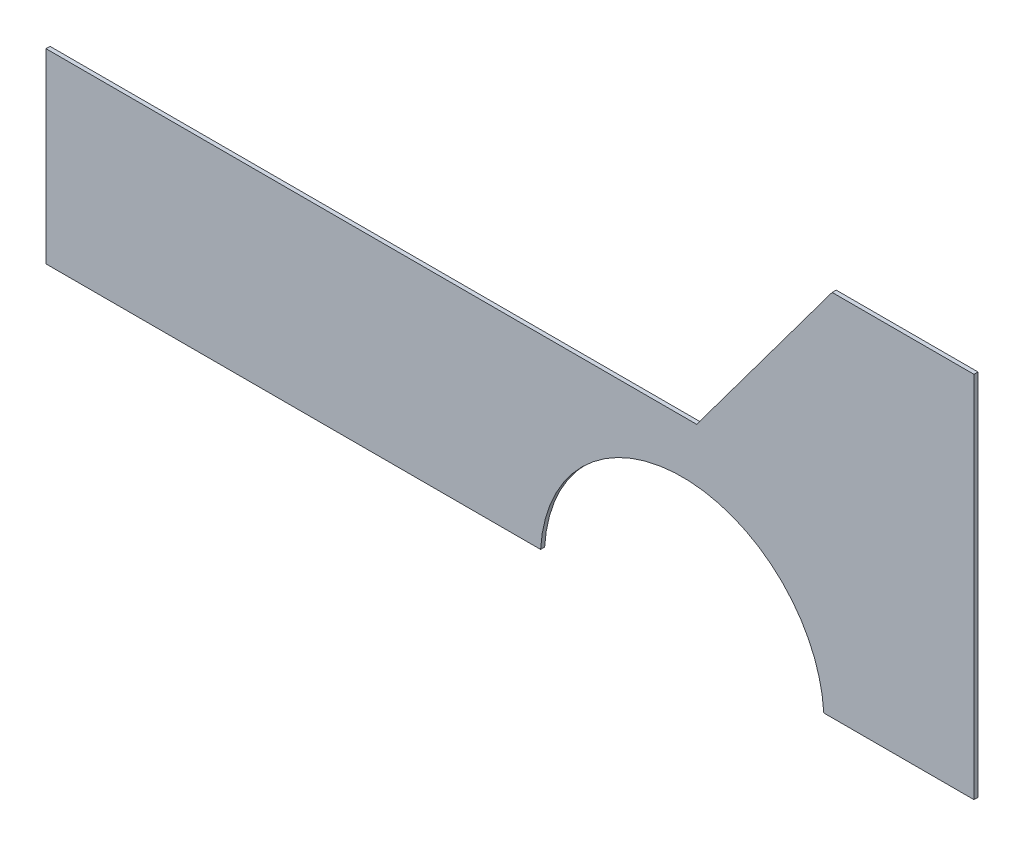
ISO-10303-21;
HEADER;
FILE_DESCRIPTION(('STEP AP214'),'2;1');
FILE_NAME('part.step','',(''),(''),'','','');
FILE_SCHEMA(('AUTOMOTIVE_DESIGN { 1 0 10303 214 1 1 1 1 }'));
ENDSEC;
DATA;
#1=APPLICATION_CONTEXT('core data for automotive mechanical design processes');
#2=APPLICATION_PROTOCOL_DEFINITION('international standard','automotive_design',2000,#1);
#3=PRODUCT_CONTEXT('',#1,'mechanical');
#4=PRODUCT('Part','Part','',(#3));
#5=PRODUCT_RELATED_PRODUCT_CATEGORY('part','',(#4));
#6=PRODUCT_DEFINITION_FORMATION('','',#4);
#7=PRODUCT_DEFINITION_CONTEXT('part definition',#1,'design');
#8=PRODUCT_DEFINITION('design','',#6,#7);
#9=PRODUCT_DEFINITION_SHAPE('','',#8);
#10=(LENGTH_UNIT() NAMED_UNIT(*) SI_UNIT(.MILLI.,.METRE.));
#11=(NAMED_UNIT(*) PLANE_ANGLE_UNIT() SI_UNIT($,.RADIAN.));
#12=(NAMED_UNIT(*) SI_UNIT($,.STERADIAN.) SOLID_ANGLE_UNIT());
#13=UNCERTAINTY_MEASURE_WITH_UNIT(LENGTH_MEASURE(1.E-05),#10,'distance_accuracy_value','');
#14=(GEOMETRIC_REPRESENTATION_CONTEXT(3) GLOBAL_UNCERTAINTY_ASSIGNED_CONTEXT((#13)) GLOBAL_UNIT_ASSIGNED_CONTEXT((#10,
#11,#12)) REPRESENTATION_CONTEXT('',''));
#15=CARTESIAN_POINT('',(0.,0.,0.));
#16=DIRECTION('',(0.,0.,1.));
#17=DIRECTION('',(1.,0.,0.));
#18=AXIS2_PLACEMENT_3D('',#15,#16,#17);
#19=CARTESIAN_POINT('',(-552.085896762579,410.889848533144,1.02046736441128));
#20=DIRECTION('',(-0.802208704708494,0.597043712042862,0.));
#21=DIRECTION('',(-0.597043712042862,-0.802208704708494,0.));
#22=AXIS2_PLACEMENT_3D('',#19,#20,#21);
#23=PLANE('',#22);
#24=DIRECTION('',(-0.597043712042862,-0.802208704708494,0.));
#25=VECTOR('',#24,1.);
#26=CARTESIAN_POINT('',(-552.085896762579,410.889848533144,2.02046736441128));
#27=LINE('',#26,#25);
#28=CARTESIAN_POINT('',(-790.231317194732,90.909375740857,2.02046736441131));
#29=VERTEX_POINT('',#28);
#30=CARTESIAN_POINT('',(-823.655113571501,45.9999999999999,2.02046736441131));
#31=VERTEX_POINT('',#30);
#32=EDGE_CURVE('E133',#29,#31,#27,.T.);
#33=ORIENTED_EDGE('',*,*,#32,.F.);
#34=DIRECTION('',(0.,0.,1.));
#35=VECTOR('',#34,1.);
#36=CARTESIAN_POINT('',(-790.231317194732,90.909375740857,1.02046736441131));
#37=LINE('',#36,#35);
#38=CARTESIAN_POINT('',(-790.231317194732,90.909375740857,1.02046736441131));
#39=VERTEX_POINT('',#38);
#40=EDGE_CURVE('E11',#39,#29,#37,.T.);
#41=ORIENTED_EDGE('',*,*,#40,.F.);
#42=DIRECTION('',(-0.597043712042862,-0.802208704708494,0.));
#43=VECTOR('',#42,1.);
#44=CARTESIAN_POINT('',(-552.085896762579,410.889848533144,1.02046736441128));
#45=LINE('',#44,#43);
#46=CARTESIAN_POINT('',(-823.655113571501,45.9999999999999,1.02046736441131));
#47=VERTEX_POINT('',#46);
#48=EDGE_CURVE('E150',#39,#47,#45,.T.);
#49=ORIENTED_EDGE('',*,*,#48,.T.);
#50=DIRECTION('',(0.,0.,1.));
#51=VECTOR('',#50,1.);
#52=CARTESIAN_POINT('',(-823.655113571501,45.9999999999999,1.02046736441131));
#53=LINE('',#52,#51);
#54=EDGE_CURVE('E90',#47,#31,#53,.T.);
#55=ORIENTED_EDGE('',*,*,#54,.T.);
#56=EDGE_LOOP('',(#33,#41,#49,#55));
#57=FACE_BOUND('',#56,.T.);
#58=ADVANCED_FACE('F40',(#57),#23,.T.);
#59=CARTESIAN_POINT('',(0.,90.909375740857,1.02046736441121));
#60=DIRECTION('',(0.,1.,0.));
#61=DIRECTION('',(0.,0.,1.));
#62=AXIS2_PLACEMENT_3D('',#59,#60,#61);
#63=PLANE('',#62);
#64=DIRECTION('',(-1.,0.,0.));
#65=VECTOR('',#64,1.);
#66=CARTESIAN_POINT('',(0.,90.909375740857,2.02046736441121));
#67=LINE('',#66,#65);
#68=CARTESIAN_POINT('',(-755.231317194732,90.909375740857,2.0204673644113));
#69=VERTEX_POINT('',#68);
#70=EDGE_CURVE('E136',#69,#29,#67,.T.);
#71=ORIENTED_EDGE('',*,*,#70,.F.);
#72=DIRECTION('',(0.,0.,1.));
#73=VECTOR('',#72,1.);
#74=CARTESIAN_POINT('',(-755.231317194732,90.909375740857,1.0204673644113));
#75=LINE('',#74,#73);
#76=CARTESIAN_POINT('',(-755.231317194732,90.909375740857,1.0204673644113));
#77=VERTEX_POINT('',#76);
#78=EDGE_CURVE('E48',#77,#69,#75,.T.);
#79=ORIENTED_EDGE('',*,*,#78,.F.);
#80=DIRECTION('',(-1.,0.,0.));
#81=VECTOR('',#80,1.);
#82=CARTESIAN_POINT('',(0.,90.909375740857,1.02046736441121));
#83=LINE('',#82,#81);
#84=EDGE_CURVE('E174',#77,#39,#83,.T.);
#85=ORIENTED_EDGE('',*,*,#84,.T.);
#86=ORIENTED_EDGE('',*,*,#40,.T.);
#87=EDGE_LOOP('',(#71,#79,#85,#86));
#88=FACE_BOUND('',#87,.T.);
#89=ADVANCED_FACE('F173',(#88),#63,.T.);
#90=CARTESIAN_POINT('',(-755.231317194732,0.,1.0204673644113));
#91=DIRECTION('',(-1.,0.,0.));
#92=DIRECTION('',(0.,0.,1.));
#93=AXIS2_PLACEMENT_3D('',#90,#91,#92);
#94=PLANE('',#93);
#95=DIRECTION('',(0.,-1.,0.));
#96=VECTOR('',#95,1.);
#97=CARTESIAN_POINT('',(-755.231317194732,0.,2.0204673644113));
#98=LINE('',#97,#96);
#99=CARTESIAN_POINT('',(-755.231317194732,0.,2.0204673644113));
#100=VERTEX_POINT('',#99);
#101=EDGE_CURVE('E139',#69,#100,#98,.T.);
#102=ORIENTED_EDGE('',*,*,#101,.T.);
#103=DIRECTION('',(0.,0.,1.));
#104=VECTOR('',#103,1.);
#105=CARTESIAN_POINT('',(-755.231317194732,0.,1.0204673644113));
#106=LINE('',#105,#104);
#107=CARTESIAN_POINT('',(-755.231317194732,0.,1.0204673644113));
#108=VERTEX_POINT('',#107);
#109=EDGE_CURVE('E157',#108,#100,#106,.T.);
#110=ORIENTED_EDGE('',*,*,#109,.F.);
#111=DIRECTION('',(0.,-1.,0.));
#112=VECTOR('',#111,1.);
#113=CARTESIAN_POINT('',(-755.231317194732,0.,1.0204673644113));
#114=LINE('',#113,#112);
#115=EDGE_CURVE('E164',#77,#108,#114,.T.);
#116=ORIENTED_EDGE('',*,*,#115,.F.);
#117=ORIENTED_EDGE('',*,*,#78,.T.);
#118=EDGE_LOOP('',(#102,#110,#116,#117));
#119=FACE_BOUND('',#118,.T.);
#120=ADVANCED_FACE('F162',(#119),#94,.F.);
#121=CARTESIAN_POINT('',(0.,0.,1.02046736441121));
#122=DIRECTION('',(0.,1.,0.));
#123=DIRECTION('',(0.,0.,1.));
#124=AXIS2_PLACEMENT_3D('',#121,#122,#123);
#125=PLANE('',#124);
#126=DIRECTION('',(-1.,0.,0.));
#127=VECTOR('',#126,1.);
#128=CARTESIAN_POINT('',(0.,0.,2.02046736441121));
#129=LINE('',#128,#127);
#130=CARTESIAN_POINT('',(-792.288506775419,0.,2.02046736441131));
#131=VERTEX_POINT('',#130);
#132=EDGE_CURVE('E141',#100,#131,#129,.T.);
#133=ORIENTED_EDGE('',*,*,#132,.T.);
#134=DIRECTION('',(0.,0.,1.));
#135=VECTOR('',#134,1.);
#136=CARTESIAN_POINT('',(-792.288506775419,0.,1.02046736441131));
#137=LINE('',#136,#135);
#138=CARTESIAN_POINT('',(-792.288506775419,0.,1.02046736441131));
#139=VERTEX_POINT('',#138);
#140=EDGE_CURVE('E154',#139,#131,#137,.T.);
#141=ORIENTED_EDGE('',*,*,#140,.F.);
#142=DIRECTION('',(-1.,0.,0.));
#143=VECTOR('',#142,1.);
#144=CARTESIAN_POINT('',(0.,0.,1.02046736441121));
#145=LINE('',#144,#143);
#146=EDGE_CURVE('E180',#108,#139,#145,.T.);
#147=ORIENTED_EDGE('',*,*,#146,.F.);
#148=ORIENTED_EDGE('',*,*,#109,.T.);
#149=EDGE_LOOP('',(#133,#141,#147,#148));
#150=FACE_BOUND('',#149,.T.);
#151=ADVANCED_FACE('F184',(#150),#125,.F.);
#152=CARTESIAN_POINT('',(-827.231317194732,-2.00000000000015,1.02046736441131));
#153=DIRECTION('',(0.,0.,1.));
#154=DIRECTION('',(1.,0.,0.));
#155=AXIS2_PLACEMENT_3D('',#152,#153,#154);
#156=CYLINDRICAL_SURFACE('',#155,35.);
#157=CARTESIAN_POINT('',(-827.231317194732,-2.00000000000015,2.02046736441131));
#158=DIRECTION('',(0.,0.,-1.));
#159=DIRECTION('',(-1.,0.,0.));
#160=AXIS2_PLACEMENT_3D('',#157,#158,#159);
#161=CIRCLE('',#160,35.);
#162=CARTESIAN_POINT('',(-862.174127614044,0.,2.02046736441132));
#163=VERTEX_POINT('',#162);
#164=EDGE_CURVE('E143',#131,#163,#161,.F.);
#165=ORIENTED_EDGE('',*,*,#164,.T.);
#166=DIRECTION('',(0.,0.,1.));
#167=VECTOR('',#166,1.);
#168=CARTESIAN_POINT('',(-862.174127614044,0.,1.02046736441132));
#169=LINE('',#168,#167);
#170=CARTESIAN_POINT('',(-862.174127614044,0.,1.02046736441132));
#171=VERTEX_POINT('',#170);
#172=EDGE_CURVE('E126',#171,#163,#169,.T.);
#173=ORIENTED_EDGE('',*,*,#172,.F.);
#174=CARTESIAN_POINT('',(-827.231317194732,-2.00000000000015,1.02046736441131));
#175=DIRECTION('',(0.,0.,-1.));
#176=DIRECTION('',(-1.,0.,0.));
#177=AXIS2_PLACEMENT_3D('',#174,#175,#176);
#178=CIRCLE('',#177,35.);
#179=EDGE_CURVE('E113',#139,#171,#178,.F.);
#180=ORIENTED_EDGE('',*,*,#179,.F.);
#181=ORIENTED_EDGE('',*,*,#140,.T.);
#182=EDGE_LOOP('',(#165,#173,#180,#181));
#183=FACE_BOUND('',#182,.T.);
#184=ADVANCED_FACE('F186',(#183),#156,.F.);
#185=CARTESIAN_POINT('',(0.,0.,1.02046736441121));
#186=DIRECTION('',(0.,1.,0.));
#187=DIRECTION('',(0.,0.,1.));
#188=AXIS2_PLACEMENT_3D('',#185,#186,#187);
#189=PLANE('',#188);
#190=DIRECTION('',(-1.,0.,0.));
#191=VECTOR('',#190,1.);
#192=CARTESIAN_POINT('',(0.,0.,2.02046736441121));
#193=LINE('',#192,#191);
#194=CARTESIAN_POINT('',(-984.231317194732,0.,2.02046736441133));
#195=VERTEX_POINT('',#194);
#196=EDGE_CURVE('E122',#163,#195,#193,.T.);
#197=ORIENTED_EDGE('',*,*,#196,.T.);
#198=DIRECTION('',(0.,0.,1.));
#199=VECTOR('',#198,1.);
#200=CARTESIAN_POINT('',(-984.231317194732,0.,1.02046736441133));
#201=LINE('',#200,#199);
#202=CARTESIAN_POINT('',(-984.231317194732,0.,1.02046736441133));
#203=VERTEX_POINT('',#202);
#204=EDGE_CURVE('E119',#203,#195,#201,.T.);
#205=ORIENTED_EDGE('',*,*,#204,.F.);
#206=DIRECTION('',(-1.,0.,0.));
#207=VECTOR('',#206,1.);
#208=CARTESIAN_POINT('',(0.,0.,1.02046736441121));
#209=LINE('',#208,#207);
#210=EDGE_CURVE('E107',#171,#203,#209,.T.);
#211=ORIENTED_EDGE('',*,*,#210,.F.);
#212=ORIENTED_EDGE('',*,*,#172,.T.);
#213=EDGE_LOOP('',(#197,#205,#211,#212));
#214=FACE_BOUND('',#213,.T.);
#215=ADVANCED_FACE('F120',(#214),#189,.F.);
#216=CARTESIAN_POINT('',(-984.231317194732,0.,1.02046736441133));
#217=DIRECTION('',(-1.,0.,0.));
#218=DIRECTION('',(0.,0.,1.));
#219=AXIS2_PLACEMENT_3D('',#216,#217,#218);
#220=PLANE('',#219);
#221=DIRECTION('',(0.,-1.,0.));
#222=VECTOR('',#221,1.);
#223=CARTESIAN_POINT('',(-984.231317194732,0.,2.02046736441133));
#224=LINE('',#223,#222);
#225=CARTESIAN_POINT('',(-984.231317194732,45.9999999999999,2.02046736441133));
#226=VERTEX_POINT('',#225);
#227=EDGE_CURVE('E146',#226,#195,#224,.T.);
#228=ORIENTED_EDGE('',*,*,#227,.F.);
#229=DIRECTION('',(0.,0.,1.));
#230=VECTOR('',#229,1.);
#231=CARTESIAN_POINT('',(-984.231317194732,45.9999999999999,1.02046736441133));
#232=LINE('',#231,#230);
#233=CARTESIAN_POINT('',(-984.231317194732,45.9999999999999,1.02046736441133));
#234=VERTEX_POINT('',#233);
#235=EDGE_CURVE('E83',#234,#226,#232,.T.);
#236=ORIENTED_EDGE('',*,*,#235,.F.);
#237=DIRECTION('',(0.,-1.,0.));
#238=VECTOR('',#237,1.);
#239=CARTESIAN_POINT('',(-984.231317194732,0.,1.02046736441133));
#240=LINE('',#239,#238);
#241=EDGE_CURVE('E111',#234,#203,#240,.T.);
#242=ORIENTED_EDGE('',*,*,#241,.T.);
#243=ORIENTED_EDGE('',*,*,#204,.T.);
#244=EDGE_LOOP('',(#228,#236,#242,#243));
#245=FACE_BOUND('',#244,.T.);
#246=ADVANCED_FACE('F128',(#245),#220,.T.);
#247=CARTESIAN_POINT('',(0.,45.9999999999999,1.02046736441121));
#248=DIRECTION('',(0.,-1.,0.));
#249=DIRECTION('',(0.,0.,-1.));
#250=AXIS2_PLACEMENT_3D('',#247,#248,#249);
#251=PLANE('',#250);
#252=DIRECTION('',(1.,0.,0.));
#253=VECTOR('',#252,1.);
#254=CARTESIAN_POINT('',(0.,45.9999999999999,2.02046736441121));
#255=LINE('',#254,#253);
#256=EDGE_CURVE('E148',#226,#31,#255,.T.);
#257=ORIENTED_EDGE('',*,*,#256,.T.);
#258=ORIENTED_EDGE('',*,*,#54,.F.);
#259=DIRECTION('',(1.,0.,0.));
#260=VECTOR('',#259,1.);
#261=CARTESIAN_POINT('',(0.,45.9999999999999,1.02046736441121));
#262=LINE('',#261,#260);
#263=EDGE_CURVE('E56',#234,#47,#262,.T.);
#264=ORIENTED_EDGE('',*,*,#263,.F.);
#265=ORIENTED_EDGE('',*,*,#235,.T.);
#266=EDGE_LOOP('',(#257,#258,#264,#265));
#267=FACE_BOUND('',#266,.T.);
#268=ADVANCED_FACE('F175',(#267),#251,.F.);
#269=CARTESIAN_POINT('',(0.,0.,1.02046736441121));
#270=DIRECTION('',(0.,0.,-1.));
#271=DIRECTION('',(-1.,0.,0.));
#272=AXIS2_PLACEMENT_3D('',#269,#270,#271);
#273=PLANE('',#272);
#274=ORIENTED_EDGE('',*,*,#48,.F.);
#275=ORIENTED_EDGE('',*,*,#84,.F.);
#276=ORIENTED_EDGE('',*,*,#115,.T.);
#277=ORIENTED_EDGE('',*,*,#146,.T.);
#278=ORIENTED_EDGE('',*,*,#179,.T.);
#279=ORIENTED_EDGE('',*,*,#210,.T.);
#280=ORIENTED_EDGE('',*,*,#241,.F.);
#281=ORIENTED_EDGE('',*,*,#263,.T.);
#282=EDGE_LOOP('',(#274,#275,#276,#277,#278,#279,#280,#281));
#283=FACE_BOUND('',#282,.T.);
#284=ADVANCED_FACE('F109',(#283),#273,.T.);
#285=CARTESIAN_POINT('',(0.,0.,2.02046736441121));
#286=DIRECTION('',(0.,0.,-1.));
#287=DIRECTION('',(-1.,0.,0.));
#288=AXIS2_PLACEMENT_3D('',#285,#286,#287);
#289=PLANE('',#288);
#290=ORIENTED_EDGE('',*,*,#32,.T.);
#291=ORIENTED_EDGE('',*,*,#256,.F.);
#292=ORIENTED_EDGE('',*,*,#227,.T.);
#293=ORIENTED_EDGE('',*,*,#196,.F.);
#294=ORIENTED_EDGE('',*,*,#164,.F.);
#295=ORIENTED_EDGE('',*,*,#132,.F.);
#296=ORIENTED_EDGE('',*,*,#101,.F.);
#297=ORIENTED_EDGE('',*,*,#70,.T.);
#298=EDGE_LOOP('',(#290,#291,#292,#293,#294,#295,#296,#297));
#299=FACE_BOUND('',#298,.T.);
#300=ADVANCED_FACE('F171',(#299),#289,.F.);
#301=CLOSED_SHELL('',(#58,#89,#120,#151,#184,#215,#246,#268,#284,#300));
#302=MANIFOLD_SOLID_BREP('B2',#301);
#303=ADVANCED_BREP_SHAPE_REPRESENTATION('',(#18,#302),#14);
#304=SHAPE_DEFINITION_REPRESENTATION(#9,#303);
ENDSEC;
END-ISO-10303-21;
